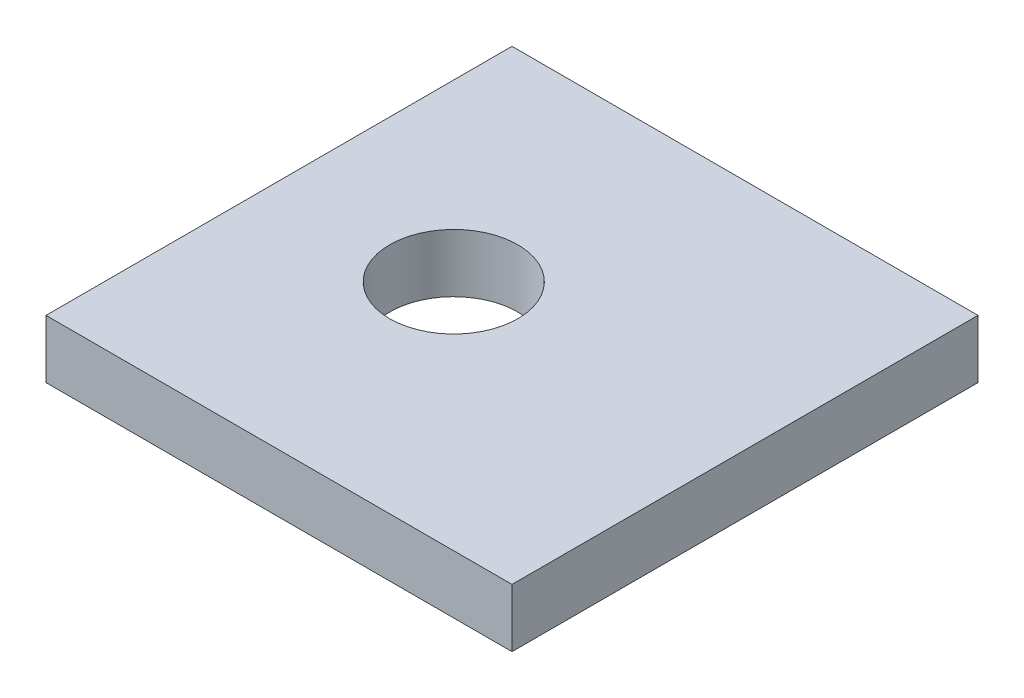
ISO-10303-21;
HEADER;
FILE_DESCRIPTION(('STEP AP214'),'2;1');
FILE_NAME('part.step','',(''),(''),'','','');
FILE_SCHEMA(('AUTOMOTIVE_DESIGN { 1 0 10303 214 1 1 1 1 }'));
ENDSEC;
DATA;
#1=APPLICATION_CONTEXT('core data for automotive mechanical design processes');
#2=APPLICATION_PROTOCOL_DEFINITION('international standard','automotive_design',2000,#1);
#3=PRODUCT_CONTEXT('',#1,'mechanical');
#4=PRODUCT('Part','Part','',(#3));
#5=PRODUCT_RELATED_PRODUCT_CATEGORY('part','',(#4));
#6=PRODUCT_DEFINITION_FORMATION('','',#4);
#7=PRODUCT_DEFINITION_CONTEXT('part definition',#1,'design');
#8=PRODUCT_DEFINITION('design','',#6,#7);
#9=PRODUCT_DEFINITION_SHAPE('','',#8);
#10=(LENGTH_UNIT() NAMED_UNIT(*) SI_UNIT(.MILLI.,.METRE.));
#11=(NAMED_UNIT(*) PLANE_ANGLE_UNIT() SI_UNIT($,.RADIAN.));
#12=(NAMED_UNIT(*) SI_UNIT($,.STERADIAN.) SOLID_ANGLE_UNIT());
#13=UNCERTAINTY_MEASURE_WITH_UNIT(LENGTH_MEASURE(1.E-05),#10,'distance_accuracy_value','');
#14=(GEOMETRIC_REPRESENTATION_CONTEXT(3) GLOBAL_UNCERTAINTY_ASSIGNED_CONTEXT((#13)) GLOBAL_UNIT_ASSIGNED_CONTEXT((#10,
#11,#12)) REPRESENTATION_CONTEXT('',''));
#15=CARTESIAN_POINT('',(0.,0.,0.));
#16=DIRECTION('',(0.,0.,1.));
#17=DIRECTION('',(1.,0.,0.));
#18=AXIS2_PLACEMENT_3D('',#15,#16,#17);
#19=CARTESIAN_POINT('',(-28.2015195369031,-124.705426917511,5.39499001028787E-13));
#20=DIRECTION('',(0.,-1.,0.));
#21=DIRECTION('',(0.,0.,-1.));
#22=AXIS2_PLACEMENT_3D('',#19,#20,#21);
#23=PLANE('',#22);
#24=CARTESIAN_POINT('',(-25.2015195369031,-124.705426917511,4.00000000000054));
#25=DIRECTION('',(0.,1.,0.));
#26=DIRECTION('',(0.,0.,1.));
#27=AXIS2_PLACEMENT_3D('',#24,#25,#26);
#28=CIRCLE('',#27,1.10000000000001);
#29=CARTESIAN_POINT('',(-25.2015195369031,-124.705426917511,5.10000000000055));
#30=VERTEX_POINT('',#29);
#31=EDGE_CURVE('E20',#30,#30,#28,.F.);
#32=ORIENTED_EDGE('',*,*,#31,.T.);
#33=EDGE_LOOP('',(#32));
#34=FACE_BOUND('',#33,.T.);
#35=DIRECTION('',(1.,0.,0.));
#36=VECTOR('',#35,1.);
#37=CARTESIAN_POINT('',(-28.2015195369031,-124.705426917511,5.39499001028787E-13));
#38=LINE('',#37,#36);
#39=CARTESIAN_POINT('',(-20.201519536903,-124.705426917511,5.39499001028787E-13));
#40=VERTEX_POINT('',#39);
#41=CARTESIAN_POINT('',(-28.2015195369031,-124.705426917511,5.39499001028787E-13));
#42=VERTEX_POINT('',#41);
#43=EDGE_CURVE('E65',#40,#42,#38,.F.);
#44=ORIENTED_EDGE('',*,*,#43,.T.);
#45=DIRECTION('',(0.,0.,1.));
#46=VECTOR('',#45,1.);
#47=CARTESIAN_POINT('',(-28.2015195369031,-124.705426917511,8.00000000000054));
#48=LINE('',#47,#46);
#49=CARTESIAN_POINT('',(-28.2015195369031,-124.705426917511,8.00000000000054));
#50=VERTEX_POINT('',#49);
#51=EDGE_CURVE('E55',#50,#42,#48,.F.);
#52=ORIENTED_EDGE('',*,*,#51,.F.);
#53=DIRECTION('',(-1.,0.,0.));
#54=VECTOR('',#53,1.);
#55=CARTESIAN_POINT('',(-28.2015195369031,-124.705426917511,8.00000000000054));
#56=LINE('',#55,#54);
#57=CARTESIAN_POINT('',(-20.201519536903,-124.705426917511,8.00000000000054));
#58=VERTEX_POINT('',#57);
#59=EDGE_CURVE('E77',#50,#58,#56,.F.);
#60=ORIENTED_EDGE('',*,*,#59,.T.);
#61=DIRECTION('',(0.,0.,1.));
#62=VECTOR('',#61,1.);
#63=CARTESIAN_POINT('',(-20.201519536903,-124.705426917511,8.00000000000054));
#64=LINE('',#63,#62);
#65=EDGE_CURVE('E68',#58,#40,#64,.F.);
#66=ORIENTED_EDGE('',*,*,#65,.T.);
#67=EDGE_LOOP('',(#44,#52,#60,#66));
#68=FACE_BOUND('',#67,.T.);
#69=ADVANCED_FACE('F17',(#34,#68),#23,.F.);
#70=CARTESIAN_POINT('',(-28.2015195369031,-124.705426917511,5.39499001028787E-13));
#71=DIRECTION('',(0.,0.,1.));
#72=DIRECTION('',(1.,0.,0.));
#73=AXIS2_PLACEMENT_3D('',#70,#71,#72);
#74=PLANE('',#73);
#75=DIRECTION('',(1.,0.,0.));
#76=VECTOR('',#75,1.);
#77=CARTESIAN_POINT('',(-28.2015195369031,-125.705426917511,5.39499001028787E-13));
#78=LINE('',#77,#76);
#79=CARTESIAN_POINT('',(-20.201519536903,-125.705426917511,5.39499001028787E-13));
#80=VERTEX_POINT('',#79);
#81=CARTESIAN_POINT('',(-28.2015195369031,-125.705426917511,5.39499001028787E-13));
#82=VERTEX_POINT('',#81);
#83=EDGE_CURVE('E75',#80,#82,#78,.F.);
#84=ORIENTED_EDGE('',*,*,#83,.T.);
#85=DIRECTION('',(0.,1.,0.));
#86=VECTOR('',#85,1.);
#87=CARTESIAN_POINT('',(-28.2015195369031,-125.705426917511,5.39499001028787E-13));
#88=LINE('',#87,#86);
#89=EDGE_CURVE('E62',#42,#82,#88,.F.);
#90=ORIENTED_EDGE('',*,*,#89,.F.);
#91=ORIENTED_EDGE('',*,*,#43,.F.);
#92=DIRECTION('',(0.,1.,0.));
#93=VECTOR('',#92,1.);
#94=CARTESIAN_POINT('',(-20.201519536903,-125.705426917511,5.39499001028787E-13));
#95=LINE('',#94,#93);
#96=EDGE_CURVE('E82',#40,#80,#95,.F.);
#97=ORIENTED_EDGE('',*,*,#96,.T.);
#98=EDGE_LOOP('',(#84,#90,#91,#97));
#99=FACE_BOUND('',#98,.T.);
#100=ADVANCED_FACE('F74',(#99),#74,.F.);
#101=CARTESIAN_POINT('',(-28.2015195369031,-125.705426917511,8.00000000000054));
#102=DIRECTION('',(-1.,0.,0.));
#103=DIRECTION('',(0.,0.,1.));
#104=AXIS2_PLACEMENT_3D('',#101,#102,#103);
#105=PLANE('',#104);
#106=ORIENTED_EDGE('',*,*,#89,.T.);
#107=DIRECTION('',(0.,0.,1.));
#108=VECTOR('',#107,1.);
#109=CARTESIAN_POINT('',(-28.2015195369031,-125.705426917511,5.39499001028787E-13));
#110=LINE('',#109,#108);
#111=CARTESIAN_POINT('',(-28.2015195369031,-125.705426917511,8.00000000000054));
#112=VERTEX_POINT('',#111);
#113=EDGE_CURVE('E86',#82,#112,#110,.T.);
#114=ORIENTED_EDGE('',*,*,#113,.T.);
#115=DIRECTION('',(0.,1.,0.));
#116=VECTOR('',#115,1.);
#117=CARTESIAN_POINT('',(-28.2015195369031,-124.705426917511,8.00000000000054));
#118=LINE('',#117,#116);
#119=EDGE_CURVE('E64',#112,#50,#118,.T.);
#120=ORIENTED_EDGE('',*,*,#119,.T.);
#121=ORIENTED_EDGE('',*,*,#51,.T.);
#122=EDGE_LOOP('',(#106,#114,#120,#121));
#123=FACE_BOUND('',#122,.T.);
#124=ADVANCED_FACE('F59',(#123),#105,.T.);
#125=CARTESIAN_POINT('',(-28.2015195369031,-124.705426917511,8.00000000000054));
#126=DIRECTION('',(0.,0.,-1.));
#127=DIRECTION('',(-1.,0.,0.));
#128=AXIS2_PLACEMENT_3D('',#125,#126,#127);
#129=PLANE('',#128);
#130=ORIENTED_EDGE('',*,*,#59,.F.);
#131=ORIENTED_EDGE('',*,*,#119,.F.);
#132=DIRECTION('',(1.,0.,0.));
#133=VECTOR('',#132,1.);
#134=CARTESIAN_POINT('',(-28.2015195369031,-125.705426917511,8.00000000000054));
#135=LINE('',#134,#133);
#136=CARTESIAN_POINT('',(-20.201519536903,-125.705426917511,8.00000000000054));
#137=VERTEX_POINT('',#136);
#138=EDGE_CURVE('E88',#112,#137,#135,.T.);
#139=ORIENTED_EDGE('',*,*,#138,.T.);
#140=DIRECTION('',(0.,1.,0.));
#141=VECTOR('',#140,1.);
#142=CARTESIAN_POINT('',(-20.201519536903,-125.705426917511,8.00000000000054));
#143=LINE('',#142,#141);
#144=EDGE_CURVE('E34',#137,#58,#143,.T.);
#145=ORIENTED_EDGE('',*,*,#144,.T.);
#146=EDGE_LOOP('',(#130,#131,#139,#145));
#147=FACE_BOUND('',#146,.T.);
#148=ADVANCED_FACE('F96',(#147),#129,.F.);
#149=CARTESIAN_POINT('',(-20.201519536903,-125.705426917511,8.00000000000054));
#150=DIRECTION('',(-1.,0.,0.));
#151=DIRECTION('',(0.,0.,1.));
#152=AXIS2_PLACEMENT_3D('',#149,#150,#151);
#153=PLANE('',#152);
#154=DIRECTION('',(0.,0.,1.));
#155=VECTOR('',#154,1.);
#156=CARTESIAN_POINT('',(-20.201519536903,-125.705426917511,5.39499001028787E-13));
#157=LINE('',#156,#155);
#158=EDGE_CURVE('E26',#137,#80,#157,.F.);
#159=ORIENTED_EDGE('',*,*,#158,.T.);
#160=ORIENTED_EDGE('',*,*,#96,.F.);
#161=ORIENTED_EDGE('',*,*,#65,.F.);
#162=ORIENTED_EDGE('',*,*,#144,.F.);
#163=EDGE_LOOP('',(#159,#160,#161,#162));
#164=FACE_BOUND('',#163,.T.);
#165=ADVANCED_FACE('F91',(#164),#153,.F.);
#166=CARTESIAN_POINT('',(-25.2015195369031,7.29457308248912,4.00000000000054));
#167=DIRECTION('',(0.,1.,0.));
#168=DIRECTION('',(0.,0.,1.));
#169=AXIS2_PLACEMENT_3D('',#166,#167,#168);
#170=CYLINDRICAL_SURFACE('',#169,1.10000000000001);
#171=CARTESIAN_POINT('',(-25.2015195369031,-125.705426917511,4.00000000000054));
#172=DIRECTION('',(0.,1.,0.));
#173=DIRECTION('',(0.,0.,1.));
#174=AXIS2_PLACEMENT_3D('',#171,#172,#173);
#175=CIRCLE('',#174,1.10000000000001);
#176=CARTESIAN_POINT('',(-25.2015195369031,-125.705426917511,5.10000000000055));
#177=VERTEX_POINT('',#176);
#178=EDGE_CURVE('E11',#177,#177,#175,.F.);
#179=ORIENTED_EDGE('',*,*,#178,.T.);
#180=EDGE_LOOP('',(#179));
#181=FACE_BOUND('',#180,.T.);
#182=ORIENTED_EDGE('',*,*,#31,.F.);
#183=EDGE_LOOP('',(#182));
#184=FACE_BOUND('',#183,.T.);
#185=ADVANCED_FACE('F104',(#181,#184),#170,.F.);
#186=CARTESIAN_POINT('',(-28.2015195369031,-125.705426917511,5.39499001028787E-13));
#187=DIRECTION('',(0.,1.,0.));
#188=DIRECTION('',(0.,0.,1.));
#189=AXIS2_PLACEMENT_3D('',#186,#187,#188);
#190=PLANE('',#189);
#191=ORIENTED_EDGE('',*,*,#178,.F.);
#192=EDGE_LOOP('',(#191));
#193=FACE_BOUND('',#192,.T.);
#194=ORIENTED_EDGE('',*,*,#138,.F.);
#195=ORIENTED_EDGE('',*,*,#113,.F.);
#196=ORIENTED_EDGE('',*,*,#83,.F.);
#197=ORIENTED_EDGE('',*,*,#158,.F.);
#198=EDGE_LOOP('',(#194,#195,#196,#197));
#199=FACE_BOUND('',#198,.T.);
#200=ADVANCED_FACE('F94',(#193,#199),#190,.F.);
#201=CLOSED_SHELL('',(#69,#100,#124,#148,#165,#185,#200));
#202=MANIFOLD_SOLID_BREP('B1',#201);
#203=ADVANCED_BREP_SHAPE_REPRESENTATION('',(#18,#202),#14);
#204=SHAPE_DEFINITION_REPRESENTATION(#9,#203);
ENDSEC;
END-ISO-10303-21;
